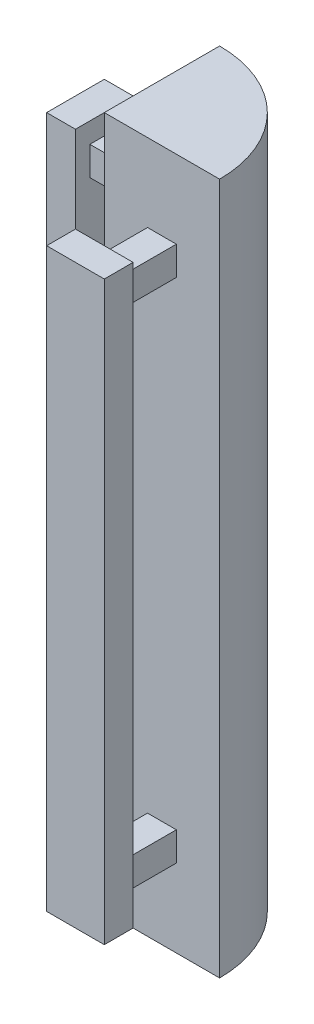
ISO-10303-21;
HEADER;
FILE_DESCRIPTION(('STEP AP214'),'2;1');
FILE_NAME('part.step','',(''),(''),'','','');
FILE_SCHEMA(('AUTOMOTIVE_DESIGN { 1 0 10303 214 1 1 1 1 }'));
ENDSEC;
DATA;
#1=APPLICATION_CONTEXT('core data for automotive mechanical design processes');
#2=APPLICATION_PROTOCOL_DEFINITION('international standard','automotive_design',2000,#1);
#3=PRODUCT_CONTEXT('',#1,'mechanical');
#4=PRODUCT('Part','Part','',(#3));
#5=PRODUCT_RELATED_PRODUCT_CATEGORY('part','',(#4));
#6=PRODUCT_DEFINITION_FORMATION('','',#4);
#7=PRODUCT_DEFINITION_CONTEXT('part definition',#1,'design');
#8=PRODUCT_DEFINITION('design','',#6,#7);
#9=PRODUCT_DEFINITION_SHAPE('','',#8);
#10=(LENGTH_UNIT() NAMED_UNIT(*) SI_UNIT(.MILLI.,.METRE.));
#11=(NAMED_UNIT(*) PLANE_ANGLE_UNIT() SI_UNIT($,.RADIAN.));
#12=(NAMED_UNIT(*) SI_UNIT($,.STERADIAN.) SOLID_ANGLE_UNIT());
#13=UNCERTAINTY_MEASURE_WITH_UNIT(LENGTH_MEASURE(1.E-05),#10,'distance_accuracy_value','');
#14=(GEOMETRIC_REPRESENTATION_CONTEXT(3) GLOBAL_UNCERTAINTY_ASSIGNED_CONTEXT((#13)) GLOBAL_UNIT_ASSIGNED_CONTEXT((#10,
#11,#12)) REPRESENTATION_CONTEXT('',''));
#15=CARTESIAN_POINT('',(0.,0.,0.));
#16=DIRECTION('',(0.,0.,1.));
#17=DIRECTION('',(1.,0.,0.));
#18=AXIS2_PLACEMENT_3D('',#15,#16,#17);
#19=CARTESIAN_POINT('',(0.,304.8,-76.2));
#20=DIRECTION('',(0.,0.,1.));
#21=DIRECTION('',(1.,0.,0.));
#22=AXIS2_PLACEMENT_3D('',#19,#20,#21);
#23=PLANE('',#22);
#24=DIRECTION('',(0.,1.,0.));
#25=VECTOR('',#24,1.);
#26=CARTESIAN_POINT('',(22.2249999999995,457.2,-76.1999999999999));
#27=LINE('',#26,#25);
#28=CARTESIAN_POINT('',(22.2250000000001,169.566930363251,-76.1999999999999));
#29=VERTEX_POINT('',#28);
#30=CARTESIAN_POINT('',(22.2250000000001,175.916930363251,-76.1999999999999));
#31=VERTEX_POINT('',#30);
#32=EDGE_CURVE('E281',#29,#31,#27,.T.);
#33=ORIENTED_EDGE('',*,*,#32,.T.);
#34=DIRECTION('',(-1.,0.,0.));
#35=VECTOR('',#34,1.);
#36=CARTESIAN_POINT('',(-63.5,175.916930363251,-76.2000000000001));
#37=LINE('',#36,#35);
#38=CARTESIAN_POINT('',(28.5750000000001,175.916930363251,-76.2));
#39=VERTEX_POINT('',#38);
#40=EDGE_CURVE('E285',#39,#31,#37,.T.);
#41=ORIENTED_EDGE('',*,*,#40,.F.);
#42=DIRECTION('',(0.,1.,0.));
#43=VECTOR('',#42,1.);
#44=CARTESIAN_POINT('',(28.5750000000001,457.2,-76.1999999999999));
#45=LINE('',#44,#43);
#46=CARTESIAN_POINT('',(28.5750000000001,169.566930363251,-76.1999999999999));
#47=VERTEX_POINT('',#46);
#48=EDGE_CURVE('E300',#47,#39,#45,.T.);
#49=ORIENTED_EDGE('',*,*,#48,.F.);
#50=DIRECTION('',(-1.,0.,0.));
#51=VECTOR('',#50,1.);
#52=CARTESIAN_POINT('',(-63.5,169.566930363251,-76.2000000000001));
#53=LINE('',#52,#51);
#54=EDGE_CURVE('E297',#47,#29,#53,.T.);
#55=ORIENTED_EDGE('',*,*,#54,.T.);
#56=EDGE_LOOP('',(#33,#41,#49,#55));
#57=FACE_BOUND('',#56,.T.);
#58=DIRECTION('',(0.,-1.,0.));
#59=VECTOR('',#58,1.);
#60=CARTESIAN_POINT('',(12.7,304.8,-76.2));
#61=LINE('',#60,#59);
#62=CARTESIAN_POINT('',(12.7,304.8,-76.2));
#63=VERTEX_POINT('',#62);
#64=CARTESIAN_POINT('',(12.7,152.4,-76.2));
#65=VERTEX_POINT('',#64);
#66=EDGE_CURVE('E421',#63,#65,#61,.T.);
#67=ORIENTED_EDGE('',*,*,#66,.T.);
#68=DIRECTION('',(-1.,0.,0.));
#69=VECTOR('',#68,1.);
#70=CARTESIAN_POINT('',(38.1,152.4,-76.2));
#71=LINE('',#70,#69);
#72=CARTESIAN_POINT('',(38.1,152.4,-76.2));
#73=VERTEX_POINT('',#72);
#74=EDGE_CURVE('E411',#73,#65,#71,.T.);
#75=ORIENTED_EDGE('',*,*,#74,.F.);
#76=DIRECTION('',(0.,-1.,0.));
#77=VECTOR('',#76,1.);
#78=CARTESIAN_POINT('',(38.1,304.8,-76.2));
#79=LINE('',#78,#77);
#80=CARTESIAN_POINT('',(38.1,304.8,-76.2));
#81=VERTEX_POINT('',#80);
#82=EDGE_CURVE('E11',#81,#73,#79,.T.);
#83=ORIENTED_EDGE('',*,*,#82,.F.);
#84=DIRECTION('',(-1.,0.,0.));
#85=VECTOR('',#84,1.);
#86=CARTESIAN_POINT('',(0.,304.8,-76.2));
#87=LINE('',#86,#85);
#88=EDGE_CURVE('E47',#81,#63,#87,.T.);
#89=ORIENTED_EDGE('',*,*,#88,.T.);
#90=EDGE_LOOP('',(#67,#75,#83,#89));
#91=FACE_BOUND('',#90,.T.);
#92=DIRECTION('',(-1.,0.,0.));
#93=VECTOR('',#92,1.);
#94=CARTESIAN_POINT('',(-63.5,281.283069636749,-76.2000000000001));
#95=LINE('',#94,#93);
#96=CARTESIAN_POINT('',(28.5750000000001,281.283069636749,-76.1999999999999));
#97=VERTEX_POINT('',#96);
#98=CARTESIAN_POINT('',(22.2250000000001,281.283069636749,-76.1999999999999));
#99=VERTEX_POINT('',#98);
#100=EDGE_CURVE('E242',#97,#99,#95,.T.);
#101=ORIENTED_EDGE('',*,*,#100,.T.);
#102=DIRECTION('',(0.,-1.,0.));
#103=VECTOR('',#102,1.);
#104=CARTESIAN_POINT('',(22.2249999999995,-1.87350135405493E-13,-76.1999999999999));
#105=LINE('',#104,#103);
#106=CARTESIAN_POINT('',(22.2250000000001,287.633069636749,-76.1999999999999));
#107=VERTEX_POINT('',#106);
#108=EDGE_CURVE('E239',#107,#99,#105,.T.);
#109=ORIENTED_EDGE('',*,*,#108,.F.);
#110=DIRECTION('',(-1.,0.,0.));
#111=VECTOR('',#110,1.);
#112=CARTESIAN_POINT('',(-63.5,287.633069636749,-76.2000000000001));
#113=LINE('',#112,#111);
#114=CARTESIAN_POINT('',(28.5750000000001,287.633069636749,-76.2));
#115=VERTEX_POINT('',#114);
#116=EDGE_CURVE('E246',#115,#107,#113,.T.);
#117=ORIENTED_EDGE('',*,*,#116,.F.);
#118=DIRECTION('',(0.,-1.,0.));
#119=VECTOR('',#118,1.);
#120=CARTESIAN_POINT('',(28.5750000000001,0.,-76.1999999999999));
#121=LINE('',#120,#119);
#122=EDGE_CURVE('E54',#115,#97,#121,.T.);
#123=ORIENTED_EDGE('',*,*,#122,.T.);
#124=EDGE_LOOP('',(#101,#109,#117,#123));
#125=FACE_BOUND('',#124,.T.);
#126=ADVANCED_FACE('F39',(#57,#91,#125),#23,.T.);
#127=CARTESIAN_POINT('',(-63.5,0.,-63.5));
#128=DIRECTION('',(0.,0.,1.));
#129=DIRECTION('',(-1.,0.,0.));
#130=AXIS2_PLACEMENT_3D('',#127,#128,#129);
#131=PLANE('',#130);
#132=DIRECTION('',(0.,-1.,0.));
#133=VECTOR('',#132,1.);
#134=CARTESIAN_POINT('',(19.05,0.,-63.4999999999999));
#135=LINE('',#134,#133);
#136=CARTESIAN_POINT('',(19.0500000000001,292.1,-63.4999999999999));
#137=VERTEX_POINT('',#136);
#138=CARTESIAN_POINT('',(19.05,165.1,-63.4999999999999));
#139=VERTEX_POINT('',#138);
#140=EDGE_CURVE('E251',#137,#139,#135,.T.);
#141=ORIENTED_EDGE('',*,*,#140,.F.);
#142=DIRECTION('',(-1.,0.,0.));
#143=VECTOR('',#142,1.);
#144=CARTESIAN_POINT('',(-63.5,292.1,-63.5));
#145=LINE('',#144,#143);
#146=CARTESIAN_POINT('',(31.7500000000001,292.1,-63.4999999999999));
#147=VERTEX_POINT('',#146);
#148=EDGE_CURVE('E255',#147,#137,#145,.T.);
#149=ORIENTED_EDGE('',*,*,#148,.F.);
#150=DIRECTION('',(0.,-1.,0.));
#151=VECTOR('',#150,1.);
#152=CARTESIAN_POINT('',(31.75,0.,-63.4999999999999));
#153=LINE('',#152,#151);
#154=CARTESIAN_POINT('',(31.75,165.1,-63.4999999999999));
#155=VERTEX_POINT('',#154);
#156=EDGE_CURVE('E269',#147,#155,#153,.T.);
#157=ORIENTED_EDGE('',*,*,#156,.T.);
#158=DIRECTION('',(-1.,0.,0.));
#159=VECTOR('',#158,1.);
#160=CARTESIAN_POINT('',(-63.5,165.1,-63.5));
#161=LINE('',#160,#159);
#162=EDGE_CURVE('E266',#155,#139,#161,.T.);
#163=ORIENTED_EDGE('',*,*,#162,.T.);
#164=EDGE_LOOP('',(#141,#149,#157,#163));
#165=FACE_BOUND('',#164,.T.);
#166=DIRECTION('',(0.,1.,0.));
#167=VECTOR('',#166,1.);
#168=CARTESIAN_POINT('',(22.2249999999994,457.2,-63.4999999999999));
#169=LINE('',#168,#167);
#170=CARTESIAN_POINT('',(22.2250000000001,169.566930363251,-63.4999999999999));
#171=VERTEX_POINT('',#170);
#172=CARTESIAN_POINT('',(22.225,175.916930363251,-63.4999999999999));
#173=VERTEX_POINT('',#172);
#174=EDGE_CURVE('E282',#171,#173,#169,.T.);
#175=ORIENTED_EDGE('',*,*,#174,.F.);
#176=DIRECTION('',(-1.,0.,0.));
#177=VECTOR('',#176,1.);
#178=CARTESIAN_POINT('',(-63.5,169.566930363251,-63.5000000000001));
#179=LINE('',#178,#177);
#180=CARTESIAN_POINT('',(28.575,169.566930363251,-63.4999999999999));
#181=VERTEX_POINT('',#180);
#182=EDGE_CURVE('E284',#181,#171,#179,.T.);
#183=ORIENTED_EDGE('',*,*,#182,.F.);
#184=DIRECTION('',(0.,1.,0.));
#185=VECTOR('',#184,1.);
#186=CARTESIAN_POINT('',(28.575,457.2,-63.4999999999999));
#187=LINE('',#186,#185);
#188=CARTESIAN_POINT('',(28.575,175.916930363251,-63.4999999999999));
#189=VERTEX_POINT('',#188);
#190=EDGE_CURVE('E288',#181,#189,#187,.T.);
#191=ORIENTED_EDGE('',*,*,#190,.T.);
#192=DIRECTION('',(-1.,0.,0.));
#193=VECTOR('',#192,1.);
#194=CARTESIAN_POINT('',(-63.5,175.916930363251,-63.5000000000001));
#195=LINE('',#194,#193);
#196=EDGE_CURVE('E291',#189,#173,#195,.T.);
#197=ORIENTED_EDGE('',*,*,#196,.T.);
#198=EDGE_LOOP('',(#175,#183,#191,#197));
#199=FACE_BOUND('',#198,.T.);
#200=DIRECTION('',(0.,-1.,0.));
#201=VECTOR('',#200,1.);
#202=CARTESIAN_POINT('',(22.2249999999994,-1.87350135405493E-13,-63.4999999999999));
#203=LINE('',#202,#201);
#204=CARTESIAN_POINT('',(22.2250000000001,287.633069636749,-63.4999999999999));
#205=VERTEX_POINT('',#204);
#206=CARTESIAN_POINT('',(22.2250000000001,281.283069636749,-63.4999999999999));
#207=VERTEX_POINT('',#206);
#208=EDGE_CURVE('E62',#205,#207,#203,.T.);
#209=ORIENTED_EDGE('',*,*,#208,.T.);
#210=DIRECTION('',(-1.,0.,0.));
#211=VECTOR('',#210,1.);
#212=CARTESIAN_POINT('',(-63.5,281.283069636749,-63.5000000000001));
#213=LINE('',#212,#211);
#214=CARTESIAN_POINT('',(28.575,281.283069636749,-63.4999999999999));
#215=VERTEX_POINT('',#214);
#216=EDGE_CURVE('E223',#215,#207,#213,.T.);
#217=ORIENTED_EDGE('',*,*,#216,.F.);
#218=DIRECTION('',(0.,-1.,0.));
#219=VECTOR('',#218,1.);
#220=CARTESIAN_POINT('',(28.575,0.,-63.4999999999999));
#221=LINE('',#220,#219);
#222=CARTESIAN_POINT('',(28.575,287.633069636749,-63.4999999999999));
#223=VERTEX_POINT('',#222);
#224=EDGE_CURVE('E217',#223,#215,#221,.T.);
#225=ORIENTED_EDGE('',*,*,#224,.F.);
#226=DIRECTION('',(-1.,0.,0.));
#227=VECTOR('',#226,1.);
#228=CARTESIAN_POINT('',(-63.5,287.633069636749,-63.5000000000001));
#229=LINE('',#228,#227);
#230=EDGE_CURVE('E220',#223,#205,#229,.T.);
#231=ORIENTED_EDGE('',*,*,#230,.T.);
#232=EDGE_LOOP('',(#209,#217,#225,#231));
#233=FACE_BOUND('',#232,.T.);
#234=ADVANCED_FACE('F218',(#165,#199,#233),#131,.F.);
#235=CARTESIAN_POINT('',(12.7,304.8,0.));
#236=DIRECTION('',(1.,0.,0.));
#237=DIRECTION('',(0.,0.,-1.));
#238=AXIS2_PLACEMENT_3D('',#235,#236,#237);
#239=PLANE('',#238);
#240=DIRECTION('',(0.,0.,-1.));
#241=VECTOR('',#240,1.);
#242=CARTESIAN_POINT('',(12.7,152.4,-76.2));
#243=LINE('',#242,#241);
#244=CARTESIAN_POINT('',(12.7,152.4,-101.6));
#245=VERTEX_POINT('',#244);
#246=EDGE_CURVE('E413',#65,#245,#243,.T.);
#247=ORIENTED_EDGE('',*,*,#246,.F.);
#248=ORIENTED_EDGE('',*,*,#66,.F.);
#249=DIRECTION('',(0.,0.,1.));
#250=VECTOR('',#249,1.);
#251=CARTESIAN_POINT('',(12.7,304.8,0.));
#252=LINE('',#251,#250);
#253=CARTESIAN_POINT('',(12.7,304.8,-101.6));
#254=VERTEX_POINT('',#253);
#255=EDGE_CURVE('E417',#254,#63,#252,.T.);
#256=ORIENTED_EDGE('',*,*,#255,.F.);
#257=DIRECTION('',(0.,-1.,0.));
#258=VECTOR('',#257,1.);
#259=CARTESIAN_POINT('',(12.7,304.8,-101.6));
#260=LINE('',#259,#258);
#261=EDGE_CURVE('E420',#254,#245,#260,.T.);
#262=ORIENTED_EDGE('',*,*,#261,.T.);
#263=EDGE_LOOP('',(#247,#248,#256,#262));
#264=FACE_BOUND('',#263,.T.);
#265=DIRECTION('',(0.,0.,1.));
#266=VECTOR('',#265,1.);
#267=CARTESIAN_POINT('',(12.7,287.633069636749,0.));
#268=LINE('',#267,#266);
#269=CARTESIAN_POINT('',(12.7,287.633069636749,-92.075));
#270=VERTEX_POINT('',#269);
#271=CARTESIAN_POINT('',(12.7,287.633069636749,-85.725));
#272=VERTEX_POINT('',#271);
#273=EDGE_CURVE('E391',#270,#272,#268,.T.);
#274=ORIENTED_EDGE('',*,*,#273,.T.);
#275=DIRECTION('',(0.,-1.,0.));
#276=VECTOR('',#275,1.);
#277=CARTESIAN_POINT('',(12.7,-1.87350135405493E-13,-85.7249999999994));
#278=LINE('',#277,#276);
#279=CARTESIAN_POINT('',(12.7,281.283069636749,-85.725));
#280=VERTEX_POINT('',#279);
#281=EDGE_CURVE('E376',#272,#280,#278,.T.);
#282=ORIENTED_EDGE('',*,*,#281,.T.);
#283=DIRECTION('',(0.,0.,1.));
#284=VECTOR('',#283,1.);
#285=CARTESIAN_POINT('',(12.7,281.283069636749,0.));
#286=LINE('',#285,#284);
#287=CARTESIAN_POINT('',(12.7,281.283069636749,-92.075));
#288=VERTEX_POINT('',#287);
#289=EDGE_CURVE('E380',#288,#280,#286,.T.);
#290=ORIENTED_EDGE('',*,*,#289,.F.);
#291=DIRECTION('',(0.,-1.,0.));
#292=VECTOR('',#291,1.);
#293=CARTESIAN_POINT('',(12.7,0.,-92.075));
#294=LINE('',#293,#292);
#295=EDGE_CURVE('E393',#270,#288,#294,.T.);
#296=ORIENTED_EDGE('',*,*,#295,.F.);
#297=EDGE_LOOP('',(#274,#282,#290,#296));
#298=FACE_BOUND('',#297,.T.);
#299=DIRECTION('',(0.,1.,0.));
#300=VECTOR('',#299,1.);
#301=CARTESIAN_POINT('',(12.7,457.2,-85.7249999999994));
#302=LINE('',#301,#300);
#303=CARTESIAN_POINT('',(12.7,169.566930363251,-85.725));
#304=VERTEX_POINT('',#303);
#305=CARTESIAN_POINT('',(12.7,175.916930363251,-85.725));
#306=VERTEX_POINT('',#305);
#307=EDGE_CURVE('E342',#304,#306,#302,.T.);
#308=ORIENTED_EDGE('',*,*,#307,.F.);
#309=DIRECTION('',(0.,0.,1.));
#310=VECTOR('',#309,1.);
#311=CARTESIAN_POINT('',(12.7,169.566930363251,0.));
#312=LINE('',#311,#310);
#313=CARTESIAN_POINT('',(12.7,169.566930363251,-92.075));
#314=VERTEX_POINT('',#313);
#315=EDGE_CURVE('E347',#314,#304,#312,.T.);
#316=ORIENTED_EDGE('',*,*,#315,.F.);
#317=DIRECTION('',(0.,1.,0.));
#318=VECTOR('',#317,1.);
#319=CARTESIAN_POINT('',(12.7,457.2,-92.075));
#320=LINE('',#319,#318);
#321=CARTESIAN_POINT('',(12.7,175.916930363251,-92.075));
#322=VERTEX_POINT('',#321);
#323=EDGE_CURVE('E361',#314,#322,#320,.T.);
#324=ORIENTED_EDGE('',*,*,#323,.T.);
#325=DIRECTION('',(0.,0.,1.));
#326=VECTOR('',#325,1.);
#327=CARTESIAN_POINT('',(12.7,175.916930363251,0.));
#328=LINE('',#327,#326);
#329=EDGE_CURVE('E359',#322,#306,#328,.T.);
#330=ORIENTED_EDGE('',*,*,#329,.T.);
#331=EDGE_LOOP('',(#308,#316,#324,#330));
#332=FACE_BOUND('',#331,.T.);
#333=ADVANCED_FACE('F436',(#264,#298,#332),#239,.F.);
#334=CARTESIAN_POINT('',(12.7,304.8,-76.2));
#335=DIRECTION('',(0.,-1.,0.));
#336=DIRECTION('',(0.,0.,-1.));
#337=AXIS2_PLACEMENT_3D('',#334,#335,#336);
#338=CYLINDRICAL_SURFACE('',#337,25.4);
#339=ORIENTED_EDGE('',*,*,#82,.T.);
#340=CARTESIAN_POINT('',(12.7,152.4,-76.2));
#341=DIRECTION('',(0.,-1.,0.));
#342=DIRECTION('',(0.,0.,-1.));
#343=AXIS2_PLACEMENT_3D('',#340,#341,#342);
#344=CIRCLE('',#343,25.4);
#345=EDGE_CURVE('E409',#245,#73,#344,.T.);
#346=ORIENTED_EDGE('',*,*,#345,.F.);
#347=ORIENTED_EDGE('',*,*,#261,.F.);
#348=CARTESIAN_POINT('',(12.7,304.8,-76.2));
#349=DIRECTION('',(0.,-1.,0.));
#350=DIRECTION('',(0.,0.,-1.));
#351=AXIS2_PLACEMENT_3D('',#348,#349,#350);
#352=CIRCLE('',#351,25.4);
#353=EDGE_CURVE('E415',#254,#81,#352,.T.);
#354=ORIENTED_EDGE('',*,*,#353,.T.);
#355=EDGE_LOOP('',(#339,#346,#347,#354));
#356=FACE_BOUND('',#355,.T.);
#357=ADVANCED_FACE('F442',(#356),#338,.T.);
#358=CARTESIAN_POINT('',(0.,304.8,0.));
#359=DIRECTION('',(0.,-1.,0.));
#360=DIRECTION('',(0.,0.,-1.));
#361=AXIS2_PLACEMENT_3D('',#358,#359,#360);
#362=PLANE('',#361);
#363=ORIENTED_EDGE('',*,*,#353,.F.);
#364=ORIENTED_EDGE('',*,*,#255,.T.);
#365=ORIENTED_EDGE('',*,*,#88,.F.);
#366=EDGE_LOOP('',(#363,#364,#365));
#367=FACE_BOUND('',#366,.T.);
#368=ADVANCED_FACE('F41',(#367),#362,.F.);
#369=CARTESIAN_POINT('',(12.7,152.4,-76.2));
#370=DIRECTION('',(0.,-1.,0.));
#371=DIRECTION('',(0.,0.,-1.));
#372=AXIS2_PLACEMENT_3D('',#369,#370,#371);
#373=PLANE('',#372);
#374=ORIENTED_EDGE('',*,*,#345,.T.);
#375=ORIENTED_EDGE('',*,*,#74,.T.);
#376=ORIENTED_EDGE('',*,*,#246,.T.);
#377=EDGE_LOOP('',(#374,#375,#376));
#378=FACE_BOUND('',#377,.T.);
#379=ADVANCED_FACE('F440',(#378),#373,.T.);
#380=CARTESIAN_POINT('',(0.,-1.87350135405493E-13,-85.7249999999994));
#381=DIRECTION('',(0.,0.,1.));
#382=DIRECTION('',(0.,-1.,0.));
#383=AXIS2_PLACEMENT_3D('',#380,#381,#382);
#384=PLANE('',#383);
#385=ORIENTED_EDGE('',*,*,#281,.F.);
#386=DIRECTION('',(1.,0.,0.));
#387=VECTOR('',#386,1.);
#388=CARTESIAN_POINT('',(0.,287.633069636749,-85.725));
#389=LINE('',#388,#387);
#390=CARTESIAN_POINT('',(0.,287.633069636749,-85.725));
#391=VERTEX_POINT('',#390);
#392=EDGE_CURVE('E406',#391,#272,#389,.T.);
#393=ORIENTED_EDGE('',*,*,#392,.F.);
#394=DIRECTION('',(0.,-1.,0.));
#395=VECTOR('',#394,1.);
#396=CARTESIAN_POINT('',(0.,-1.87350135405493E-13,-85.7249999999994));
#397=LINE('',#396,#395);
#398=CARTESIAN_POINT('',(0.,281.283069636749,-85.725));
#399=VERTEX_POINT('',#398);
#400=EDGE_CURVE('E377',#391,#399,#397,.T.);
#401=ORIENTED_EDGE('',*,*,#400,.T.);
#402=DIRECTION('',(1.,0.,0.));
#403=VECTOR('',#402,1.);
#404=CARTESIAN_POINT('',(0.,281.283069636749,-85.725));
#405=LINE('',#404,#403);
#406=EDGE_CURVE('E389',#399,#280,#405,.T.);
#407=ORIENTED_EDGE('',*,*,#406,.T.);
#408=EDGE_LOOP('',(#385,#393,#401,#407));
#409=FACE_BOUND('',#408,.T.);
#410=ADVANCED_FACE('F537',(#409),#384,.T.);
#411=CARTESIAN_POINT('',(0.,287.633069636749,0.));
#412=DIRECTION('',(0.,1.,0.));
#413=DIRECTION('',(0.,0.,1.));
#414=AXIS2_PLACEMENT_3D('',#411,#412,#413);
#415=PLANE('',#414);
#416=ORIENTED_EDGE('',*,*,#273,.F.);
#417=DIRECTION('',(1.,0.,0.));
#418=VECTOR('',#417,1.);
#419=CARTESIAN_POINT('',(0.,287.633069636749,-92.075));
#420=LINE('',#419,#418);
#421=CARTESIAN_POINT('',(0.,287.633069636749,-92.075));
#422=VERTEX_POINT('',#421);
#423=EDGE_CURVE('E403',#422,#270,#420,.T.);
#424=ORIENTED_EDGE('',*,*,#423,.F.);
#425=DIRECTION('',(0.,0.,1.));
#426=VECTOR('',#425,1.);
#427=CARTESIAN_POINT('',(0.,287.633069636749,0.));
#428=LINE('',#427,#426);
#429=EDGE_CURVE('E379',#422,#391,#428,.T.);
#430=ORIENTED_EDGE('',*,*,#429,.T.);
#431=ORIENTED_EDGE('',*,*,#392,.T.);
#432=EDGE_LOOP('',(#416,#424,#430,#431));
#433=FACE_BOUND('',#432,.T.);
#434=ADVANCED_FACE('F533',(#433),#415,.T.);
#435=CARTESIAN_POINT('',(0.,0.,-92.075));
#436=DIRECTION('',(0.,0.,1.));
#437=DIRECTION('',(1.,0.,0.));
#438=AXIS2_PLACEMENT_3D('',#435,#436,#437);
#439=PLANE('',#438);
#440=ORIENTED_EDGE('',*,*,#295,.T.);
#441=DIRECTION('',(1.,0.,0.));
#442=VECTOR('',#441,1.);
#443=CARTESIAN_POINT('',(0.,281.283069636749,-92.075));
#444=LINE('',#443,#442);
#445=CARTESIAN_POINT('',(0.,281.283069636749,-92.075));
#446=VERTEX_POINT('',#445);
#447=EDGE_CURVE('E400',#446,#288,#444,.T.);
#448=ORIENTED_EDGE('',*,*,#447,.F.);
#449=DIRECTION('',(0.,-1.,0.));
#450=VECTOR('',#449,1.);
#451=CARTESIAN_POINT('',(0.,0.,-92.075));
#452=LINE('',#451,#450);
#453=EDGE_CURVE('E383',#422,#446,#452,.T.);
#454=ORIENTED_EDGE('',*,*,#453,.F.);
#455=ORIENTED_EDGE('',*,*,#423,.T.);
#456=EDGE_LOOP('',(#440,#448,#454,#455));
#457=FACE_BOUND('',#456,.T.);
#458=ADVANCED_FACE('F529',(#457),#439,.F.);
#459=CARTESIAN_POINT('',(0.,281.283069636749,0.));
#460=DIRECTION('',(0.,1.,0.));
#461=DIRECTION('',(0.,0.,1.));
#462=AXIS2_PLACEMENT_3D('',#459,#460,#461);
#463=PLANE('',#462);
#464=ORIENTED_EDGE('',*,*,#289,.T.);
#465=ORIENTED_EDGE('',*,*,#406,.F.);
#466=DIRECTION('',(0.,0.,1.));
#467=VECTOR('',#466,1.);
#468=CARTESIAN_POINT('',(0.,281.283069636749,0.));
#469=LINE('',#468,#467);
#470=EDGE_CURVE('E386',#446,#399,#469,.T.);
#471=ORIENTED_EDGE('',*,*,#470,.F.);
#472=ORIENTED_EDGE('',*,*,#447,.T.);
#473=EDGE_LOOP('',(#464,#465,#471,#472));
#474=FACE_BOUND('',#473,.T.);
#475=ADVANCED_FACE('F525',(#474),#463,.F.);
#476=CARTESIAN_POINT('',(0.,457.2,-85.7249999999994));
#477=DIRECTION('',(0.,0.,-1.));
#478=DIRECTION('',(0.,1.,0.));
#479=AXIS2_PLACEMENT_3D('',#476,#477,#478);
#480=PLANE('',#479);
#481=ORIENTED_EDGE('',*,*,#307,.T.);
#482=DIRECTION('',(1.,0.,0.));
#483=VECTOR('',#482,1.);
#484=CARTESIAN_POINT('',(0.,175.916930363251,-85.725));
#485=LINE('',#484,#483);
#486=CARTESIAN_POINT('',(0.,175.916930363251,-85.725));
#487=VERTEX_POINT('',#486);
#488=EDGE_CURVE('E373',#487,#306,#485,.T.);
#489=ORIENTED_EDGE('',*,*,#488,.F.);
#490=DIRECTION('',(0.,1.,0.));
#491=VECTOR('',#490,1.);
#492=CARTESIAN_POINT('',(0.,457.2,-85.7249999999994));
#493=LINE('',#492,#491);
#494=CARTESIAN_POINT('',(0.,169.566930363251,-85.725));
#495=VERTEX_POINT('',#494);
#496=EDGE_CURVE('E343',#495,#487,#493,.T.);
#497=ORIENTED_EDGE('',*,*,#496,.F.);
#498=DIRECTION('',(1.,0.,0.));
#499=VECTOR('',#498,1.);
#500=CARTESIAN_POINT('',(0.,169.566930363251,-85.725));
#501=LINE('',#500,#499);
#502=EDGE_CURVE('E356',#495,#304,#501,.T.);
#503=ORIENTED_EDGE('',*,*,#502,.T.);
#504=EDGE_LOOP('',(#481,#489,#497,#503));
#505=FACE_BOUND('',#504,.T.);
#506=ADVANCED_FACE('F521',(#505),#480,.F.);
#507=CARTESIAN_POINT('',(0.,175.916930363251,0.));
#508=DIRECTION('',(0.,1.,0.));
#509=DIRECTION('',(0.,0.,1.));
#510=AXIS2_PLACEMENT_3D('',#507,#508,#509);
#511=PLANE('',#510);
#512=ORIENTED_EDGE('',*,*,#329,.F.);
#513=DIRECTION('',(1.,0.,0.));
#514=VECTOR('',#513,1.);
#515=CARTESIAN_POINT('',(0.,175.916930363251,-92.075));
#516=LINE('',#515,#514);
#517=CARTESIAN_POINT('',(0.,175.916930363251,-92.075));
#518=VERTEX_POINT('',#517);
#519=EDGE_CURVE('E370',#518,#322,#516,.T.);
#520=ORIENTED_EDGE('',*,*,#519,.F.);
#521=DIRECTION('',(0.,0.,1.));
#522=VECTOR('',#521,1.);
#523=CARTESIAN_POINT('',(0.,175.916930363251,0.));
#524=LINE('',#523,#522);
#525=EDGE_CURVE('E346',#518,#487,#524,.T.);
#526=ORIENTED_EDGE('',*,*,#525,.T.);
#527=ORIENTED_EDGE('',*,*,#488,.T.);
#528=EDGE_LOOP('',(#512,#520,#526,#527));
#529=FACE_BOUND('',#528,.T.);
#530=ADVANCED_FACE('F517',(#529),#511,.T.);
#531=CARTESIAN_POINT('',(0.,457.2,-92.075));
#532=DIRECTION('',(0.,0.,-1.));
#533=DIRECTION('',(-1.,0.,0.));
#534=AXIS2_PLACEMENT_3D('',#531,#532,#533);
#535=PLANE('',#534);
#536=ORIENTED_EDGE('',*,*,#323,.F.);
#537=DIRECTION('',(1.,0.,0.));
#538=VECTOR('',#537,1.);
#539=CARTESIAN_POINT('',(0.,169.566930363251,-92.075));
#540=LINE('',#539,#538);
#541=CARTESIAN_POINT('',(0.,169.566930363251,-92.075));
#542=VERTEX_POINT('',#541);
#543=EDGE_CURVE('E367',#542,#314,#540,.T.);
#544=ORIENTED_EDGE('',*,*,#543,.F.);
#545=DIRECTION('',(0.,1.,0.));
#546=VECTOR('',#545,1.);
#547=CARTESIAN_POINT('',(0.,457.2,-92.075));
#548=LINE('',#547,#546);
#549=EDGE_CURVE('E350',#542,#518,#548,.T.);
#550=ORIENTED_EDGE('',*,*,#549,.T.);
#551=ORIENTED_EDGE('',*,*,#519,.T.);
#552=EDGE_LOOP('',(#536,#544,#550,#551));
#553=FACE_BOUND('',#552,.T.);
#554=ADVANCED_FACE('F513',(#553),#535,.T.);
#555=CARTESIAN_POINT('',(0.,169.566930363251,0.));
#556=DIRECTION('',(0.,1.,0.));
#557=DIRECTION('',(0.,0.,1.));
#558=AXIS2_PLACEMENT_3D('',#555,#556,#557);
#559=PLANE('',#558);
#560=ORIENTED_EDGE('',*,*,#315,.T.);
#561=ORIENTED_EDGE('',*,*,#502,.F.);
#562=DIRECTION('',(0.,0.,1.));
#563=VECTOR('',#562,1.);
#564=CARTESIAN_POINT('',(0.,169.566930363251,0.));
#565=LINE('',#564,#563);
#566=EDGE_CURVE('E353',#542,#495,#565,.T.);
#567=ORIENTED_EDGE('',*,*,#566,.F.);
#568=ORIENTED_EDGE('',*,*,#543,.T.);
#569=EDGE_LOOP('',(#560,#561,#567,#568));
#570=FACE_BOUND('',#569,.T.);
#571=ADVANCED_FACE('F495',(#570),#559,.F.);
#572=CARTESIAN_POINT('',(0.,0.,0.));
#573=DIRECTION('',(-1.,0.,0.));
#574=DIRECTION('',(0.,0.,1.));
#575=AXIS2_PLACEMENT_3D('',#572,#573,#574);
#576=PLANE('',#575);
#577=ORIENTED_EDGE('',*,*,#400,.F.);
#578=ORIENTED_EDGE('',*,*,#429,.F.);
#579=ORIENTED_EDGE('',*,*,#453,.T.);
#580=ORIENTED_EDGE('',*,*,#470,.T.);
#581=EDGE_LOOP('',(#577,#578,#579,#580));
#582=FACE_BOUND('',#581,.T.);
#583=DIRECTION('',(0.,-1.,0.));
#584=VECTOR('',#583,1.);
#585=CARTESIAN_POINT('',(0.,0.,-82.55));
#586=LINE('',#585,#584);
#587=CARTESIAN_POINT('',(0.,292.1,-82.55));
#588=VERTEX_POINT('',#587);
#589=CARTESIAN_POINT('',(0.,165.1,-82.55));
#590=VERTEX_POINT('',#589);
#591=EDGE_CURVE('E312',#588,#590,#586,.T.);
#592=ORIENTED_EDGE('',*,*,#591,.T.);
#593=DIRECTION('',(0.,0.,1.));
#594=VECTOR('',#593,1.);
#595=CARTESIAN_POINT('',(0.,165.1,0.));
#596=LINE('',#595,#594);
#597=CARTESIAN_POINT('',(0.,165.1,-95.25));
#598=VERTEX_POINT('',#597);
#599=EDGE_CURVE('E317',#598,#590,#596,.T.);
#600=ORIENTED_EDGE('',*,*,#599,.F.);
#601=DIRECTION('',(0.,-1.,0.));
#602=VECTOR('',#601,1.);
#603=CARTESIAN_POINT('',(0.,0.,-95.25));
#604=LINE('',#603,#602);
#605=CARTESIAN_POINT('',(0.,292.1,-95.25));
#606=VERTEX_POINT('',#605);
#607=EDGE_CURVE('E330',#606,#598,#604,.T.);
#608=ORIENTED_EDGE('',*,*,#607,.F.);
#609=DIRECTION('',(0.,0.,1.));
#610=VECTOR('',#609,1.);
#611=CARTESIAN_POINT('',(0.,292.1,0.));
#612=LINE('',#611,#610);
#613=EDGE_CURVE('E327',#606,#588,#612,.T.);
#614=ORIENTED_EDGE('',*,*,#613,.T.);
#615=EDGE_LOOP('',(#592,#600,#608,#614));
#616=FACE_BOUND('',#615,.T.);
#617=ORIENTED_EDGE('',*,*,#566,.T.);
#618=ORIENTED_EDGE('',*,*,#496,.T.);
#619=ORIENTED_EDGE('',*,*,#525,.F.);
#620=ORIENTED_EDGE('',*,*,#549,.F.);
#621=EDGE_LOOP('',(#617,#618,#619,#620));
#622=FACE_BOUND('',#621,.T.);
#623=ADVANCED_FACE('F491',(#582,#616,#622),#576,.F.);
#624=CARTESIAN_POINT('',(-6.35000000000001,0.,-82.55));
#625=DIRECTION('',(0.,0.,1.));
#626=DIRECTION('',(0.,-1.,0.));
#627=AXIS2_PLACEMENT_3D('',#624,#625,#626);
#628=PLANE('',#627);
#629=ORIENTED_EDGE('',*,*,#591,.F.);
#630=DIRECTION('',(1.,0.,0.));
#631=VECTOR('',#630,1.);
#632=CARTESIAN_POINT('',(-6.35000000000001,292.1,-82.55));
#633=LINE('',#632,#631);
#634=CARTESIAN_POINT('',(-6.35000000000001,292.1,-82.55));
#635=VERTEX_POINT('',#634);
#636=EDGE_CURVE('E340',#635,#588,#633,.T.);
#637=ORIENTED_EDGE('',*,*,#636,.F.);
#638=DIRECTION('',(0.,-1.,0.));
#639=VECTOR('',#638,1.);
#640=CARTESIAN_POINT('',(-6.35000000000001,0.,-82.55));
#641=LINE('',#640,#639);
#642=CARTESIAN_POINT('',(-6.35000000000001,165.1,-82.55));
#643=VERTEX_POINT('',#642);
#644=EDGE_CURVE('E313',#635,#643,#641,.T.);
#645=ORIENTED_EDGE('',*,*,#644,.T.);
#646=DIRECTION('',(1.,0.,0.));
#647=VECTOR('',#646,1.);
#648=CARTESIAN_POINT('',(-6.35000000000001,165.1,-82.55));
#649=LINE('',#648,#647);
#650=EDGE_CURVE('E324',#643,#590,#649,.T.);
#651=ORIENTED_EDGE('',*,*,#650,.T.);
#652=EDGE_LOOP('',(#629,#637,#645,#651));
#653=FACE_BOUND('',#652,.T.);
#654=ADVANCED_FACE('F494',(#653),#628,.T.);
#655=CARTESIAN_POINT('',(-6.35,292.1,0.));
#656=DIRECTION('',(0.,1.,0.));
#657=DIRECTION('',(0.,0.,1.));
#658=AXIS2_PLACEMENT_3D('',#655,#656,#657);
#659=PLANE('',#658);
#660=ORIENTED_EDGE('',*,*,#613,.F.);
#661=DIRECTION('',(1.,0.,0.));
#662=VECTOR('',#661,1.);
#663=CARTESIAN_POINT('',(-6.35000000000001,292.1,-95.25));
#664=LINE('',#663,#662);
#665=CARTESIAN_POINT('',(-6.35000000000001,292.1,-95.25));
#666=VERTEX_POINT('',#665);
#667=EDGE_CURVE('E338',#666,#606,#664,.T.);
#668=ORIENTED_EDGE('',*,*,#667,.F.);
#669=DIRECTION('',(0.,0.,1.));
#670=VECTOR('',#669,1.);
#671=CARTESIAN_POINT('',(-6.35,292.1,0.));
#672=LINE('',#671,#670);
#673=EDGE_CURVE('E316',#666,#635,#672,.T.);
#674=ORIENTED_EDGE('',*,*,#673,.T.);
#675=ORIENTED_EDGE('',*,*,#636,.T.);
#676=EDGE_LOOP('',(#660,#668,#674,#675));
#677=FACE_BOUND('',#676,.T.);
#678=ADVANCED_FACE('F503',(#677),#659,.T.);
#679=CARTESIAN_POINT('',(-6.35000000000001,0.,-95.25));
#680=DIRECTION('',(0.,0.,1.));
#681=DIRECTION('',(0.,-1.,0.));
#682=AXIS2_PLACEMENT_3D('',#679,#680,#681);
#683=PLANE('',#682);
#684=ORIENTED_EDGE('',*,*,#607,.T.);
#685=DIRECTION('',(1.,0.,0.));
#686=VECTOR('',#685,1.);
#687=CARTESIAN_POINT('',(-6.35000000000001,165.1,-95.25));
#688=LINE('',#687,#686);
#689=CARTESIAN_POINT('',(-6.35000000000001,165.1,-95.25));
#690=VERTEX_POINT('',#689);
#691=EDGE_CURVE('E335',#690,#598,#688,.T.);
#692=ORIENTED_EDGE('',*,*,#691,.F.);
#693=DIRECTION('',(0.,-1.,0.));
#694=VECTOR('',#693,1.);
#695=CARTESIAN_POINT('',(-6.35000000000001,0.,-95.25));
#696=LINE('',#695,#694);
#697=EDGE_CURVE('E320',#666,#690,#696,.T.);
#698=ORIENTED_EDGE('',*,*,#697,.F.);
#699=ORIENTED_EDGE('',*,*,#667,.T.);
#700=EDGE_LOOP('',(#684,#692,#698,#699));
#701=FACE_BOUND('',#700,.T.);
#702=ADVANCED_FACE('F499',(#701),#683,.F.);
#703=CARTESIAN_POINT('',(-6.35,165.1,0.));
#704=DIRECTION('',(0.,1.,0.));
#705=DIRECTION('',(0.,0.,1.));
#706=AXIS2_PLACEMENT_3D('',#703,#704,#705);
#707=PLANE('',#706);
#708=ORIENTED_EDGE('',*,*,#599,.T.);
#709=ORIENTED_EDGE('',*,*,#650,.F.);
#710=DIRECTION('',(0.,0.,1.));
#711=VECTOR('',#710,1.);
#712=CARTESIAN_POINT('',(-6.35,165.1,0.));
#713=LINE('',#712,#711);
#714=EDGE_CURVE('E322',#690,#643,#713,.T.);
#715=ORIENTED_EDGE('',*,*,#714,.F.);
#716=ORIENTED_EDGE('',*,*,#691,.T.);
#717=EDGE_LOOP('',(#708,#709,#715,#716));
#718=FACE_BOUND('',#717,.T.);
#719=ADVANCED_FACE('F489',(#718),#707,.F.);
#720=CARTESIAN_POINT('',(-6.35,0.,0.));
#721=DIRECTION('',(-1.,0.,0.));
#722=DIRECTION('',(0.,0.,1.));
#723=AXIS2_PLACEMENT_3D('',#720,#721,#722);
#724=PLANE('',#723);
#725=ORIENTED_EDGE('',*,*,#644,.F.);
#726=ORIENTED_EDGE('',*,*,#673,.F.);
#727=ORIENTED_EDGE('',*,*,#697,.T.);
#728=ORIENTED_EDGE('',*,*,#714,.T.);
#729=EDGE_LOOP('',(#725,#726,#727,#728));
#730=FACE_BOUND('',#729,.T.);
#731=ADVANCED_FACE('F483',(#730),#724,.T.);
#732=CARTESIAN_POINT('',(22.2249999999994,457.2,-63.4999999999999));
#733=DIRECTION('',(-1.,0.,0.));
#734=DIRECTION('',(0.,-1.,0.));
#735=AXIS2_PLACEMENT_3D('',#732,#733,#734);
#736=PLANE('',#735);
#737=ORIENTED_EDGE('',*,*,#32,.F.);
#738=DIRECTION('',(0.,0.,-1.));
#739=VECTOR('',#738,1.);
#740=CARTESIAN_POINT('',(22.2250000000001,169.566930363251,-63.4999999999999));
#741=LINE('',#740,#739);
#742=EDGE_CURVE('E310',#171,#29,#741,.T.);
#743=ORIENTED_EDGE('',*,*,#742,.F.);
#744=ORIENTED_EDGE('',*,*,#174,.T.);
#745=DIRECTION('',(0.,0.,-1.));
#746=VECTOR('',#745,1.);
#747=CARTESIAN_POINT('',(22.225,175.916930363251,-63.4999999999999));
#748=LINE('',#747,#746);
#749=EDGE_CURVE('E294',#173,#31,#748,.T.);
#750=ORIENTED_EDGE('',*,*,#749,.T.);
#751=EDGE_LOOP('',(#737,#743,#744,#750));
#752=FACE_BOUND('',#751,.T.);
#753=ADVANCED_FACE('F463',(#752),#736,.T.);
#754=CARTESIAN_POINT('',(-63.5,169.566930363251,-63.5000000000001));
#755=DIRECTION('',(0.,-1.,0.));
#756=DIRECTION('',(0.,0.,-1.));
#757=AXIS2_PLACEMENT_3D('',#754,#755,#756);
#758=PLANE('',#757);
#759=ORIENTED_EDGE('',*,*,#54,.F.);
#760=DIRECTION('',(0.,0.,-1.));
#761=VECTOR('',#760,1.);
#762=CARTESIAN_POINT('',(28.575,169.566930363251,-63.4999999999999));
#763=LINE('',#762,#761);
#764=EDGE_CURVE('E308',#181,#47,#763,.T.);
#765=ORIENTED_EDGE('',*,*,#764,.F.);
#766=ORIENTED_EDGE('',*,*,#182,.T.);
#767=ORIENTED_EDGE('',*,*,#742,.T.);
#768=EDGE_LOOP('',(#759,#765,#766,#767));
#769=FACE_BOUND('',#768,.T.);
#770=ADVANCED_FACE('F474',(#769),#758,.T.);
#771=CARTESIAN_POINT('',(28.575,457.2,-63.4999999999999));
#772=DIRECTION('',(-1.,0.,0.));
#773=DIRECTION('',(0.,0.,1.));
#774=AXIS2_PLACEMENT_3D('',#771,#772,#773);
#775=PLANE('',#774);
#776=ORIENTED_EDGE('',*,*,#48,.T.);
#777=DIRECTION('',(0.,0.,-1.));
#778=VECTOR('',#777,1.);
#779=CARTESIAN_POINT('',(28.575,175.916930363251,-63.4999999999999));
#780=LINE('',#779,#778);
#781=EDGE_CURVE('E306',#189,#39,#780,.T.);
#782=ORIENTED_EDGE('',*,*,#781,.F.);
#783=ORIENTED_EDGE('',*,*,#190,.F.);
#784=ORIENTED_EDGE('',*,*,#764,.T.);
#785=EDGE_LOOP('',(#776,#782,#783,#784));
#786=FACE_BOUND('',#785,.T.);
#787=ADVANCED_FACE('F471',(#786),#775,.F.);
#788=CARTESIAN_POINT('',(-63.5,175.916930363251,-63.5000000000001));
#789=DIRECTION('',(0.,-1.,0.));
#790=DIRECTION('',(0.,0.,-1.));
#791=AXIS2_PLACEMENT_3D('',#788,#789,#790);
#792=PLANE('',#791);
#793=ORIENTED_EDGE('',*,*,#40,.T.);
#794=ORIENTED_EDGE('',*,*,#749,.F.);
#795=ORIENTED_EDGE('',*,*,#196,.F.);
#796=ORIENTED_EDGE('',*,*,#781,.T.);
#797=EDGE_LOOP('',(#793,#794,#795,#796));
#798=FACE_BOUND('',#797,.T.);
#799=ADVANCED_FACE('F468',(#798),#792,.F.);
#800=CARTESIAN_POINT('',(19.05,0.,-57.1499999999999));
#801=DIRECTION('',(1.,0.,0.));
#802=DIRECTION('',(0.,0.,-1.));
#803=AXIS2_PLACEMENT_3D('',#800,#801,#802);
#804=PLANE('',#803);
#805=ORIENTED_EDGE('',*,*,#140,.T.);
#806=DIRECTION('',(0.,0.,-1.));
#807=VECTOR('',#806,1.);
#808=CARTESIAN_POINT('',(19.05,165.1,-57.1499999999999));
#809=LINE('',#808,#807);
#810=CARTESIAN_POINT('',(19.05,165.1,-57.1499999999999));
#811=VERTEX_POINT('',#810);
#812=EDGE_CURVE('E279',#811,#139,#809,.T.);
#813=ORIENTED_EDGE('',*,*,#812,.F.);
#814=DIRECTION('',(0.,-1.,0.));
#815=VECTOR('',#814,1.);
#816=CARTESIAN_POINT('',(19.05,0.,-57.1499999999999));
#817=LINE('',#816,#815);
#818=CARTESIAN_POINT('',(19.05,292.1,-57.1499999999999));
#819=VERTEX_POINT('',#818);
#820=EDGE_CURVE('E252',#819,#811,#817,.T.);
#821=ORIENTED_EDGE('',*,*,#820,.F.);
#822=DIRECTION('',(0.,0.,-1.));
#823=VECTOR('',#822,1.);
#824=CARTESIAN_POINT('',(19.05,292.1,-57.1499999999999));
#825=LINE('',#824,#823);
#826=EDGE_CURVE('E263',#819,#137,#825,.T.);
#827=ORIENTED_EDGE('',*,*,#826,.T.);
#828=EDGE_LOOP('',(#805,#813,#821,#827));
#829=FACE_BOUND('',#828,.T.);
#830=ADVANCED_FACE('F632',(#829),#804,.F.);
#831=CARTESIAN_POINT('',(-63.5,165.1,-57.15));
#832=DIRECTION('',(0.,-1.,0.));
#833=DIRECTION('',(0.,0.,-1.));
#834=AXIS2_PLACEMENT_3D('',#831,#832,#833);
#835=PLANE('',#834);
#836=ORIENTED_EDGE('',*,*,#162,.F.);
#837=DIRECTION('',(0.,0.,-1.));
#838=VECTOR('',#837,1.);
#839=CARTESIAN_POINT('',(31.75,165.1,-57.1499999999999));
#840=LINE('',#839,#838);
#841=CARTESIAN_POINT('',(31.75,165.1,-57.1499999999999));
#842=VERTEX_POINT('',#841);
#843=EDGE_CURVE('E277',#842,#155,#840,.T.);
#844=ORIENTED_EDGE('',*,*,#843,.F.);
#845=DIRECTION('',(-1.,0.,0.));
#846=VECTOR('',#845,1.);
#847=CARTESIAN_POINT('',(-63.5,165.1,-57.15));
#848=LINE('',#847,#846);
#849=EDGE_CURVE('E254',#842,#811,#848,.T.);
#850=ORIENTED_EDGE('',*,*,#849,.T.);
#851=ORIENTED_EDGE('',*,*,#812,.T.);
#852=EDGE_LOOP('',(#836,#844,#850,#851));
#853=FACE_BOUND('',#852,.T.);
#854=ADVANCED_FACE('F642',(#853),#835,.T.);
#855=CARTESIAN_POINT('',(31.75,0.,-57.1499999999999));
#856=DIRECTION('',(1.,0.,0.));
#857=DIRECTION('',(0.,0.,-1.));
#858=AXIS2_PLACEMENT_3D('',#855,#856,#857);
#859=PLANE('',#858);
#860=ORIENTED_EDGE('',*,*,#156,.F.);
#861=DIRECTION('',(0.,0.,-1.));
#862=VECTOR('',#861,1.);
#863=CARTESIAN_POINT('',(31.75,292.1,-57.1499999999999));
#864=LINE('',#863,#862);
#865=CARTESIAN_POINT('',(31.75,292.1,-57.1499999999999));
#866=VERTEX_POINT('',#865);
#867=EDGE_CURVE('E275',#866,#147,#864,.T.);
#868=ORIENTED_EDGE('',*,*,#867,.F.);
#869=DIRECTION('',(0.,-1.,0.));
#870=VECTOR('',#869,1.);
#871=CARTESIAN_POINT('',(31.75,0.,-57.1499999999999));
#872=LINE('',#871,#870);
#873=EDGE_CURVE('E258',#866,#842,#872,.T.);
#874=ORIENTED_EDGE('',*,*,#873,.T.);
#875=ORIENTED_EDGE('',*,*,#843,.T.);
#876=EDGE_LOOP('',(#860,#868,#874,#875));
#877=FACE_BOUND('',#876,.T.);
#878=ADVANCED_FACE('F653',(#877),#859,.T.);
#879=CARTESIAN_POINT('',(-63.5,292.1,-57.15));
#880=DIRECTION('',(0.,-1.,0.));
#881=DIRECTION('',(0.,0.,-1.));
#882=AXIS2_PLACEMENT_3D('',#879,#880,#881);
#883=PLANE('',#882);
#884=ORIENTED_EDGE('',*,*,#148,.T.);
#885=ORIENTED_EDGE('',*,*,#826,.F.);
#886=DIRECTION('',(-1.,0.,0.));
#887=VECTOR('',#886,1.);
#888=CARTESIAN_POINT('',(-63.5,292.1,-57.15));
#889=LINE('',#888,#887);
#890=EDGE_CURVE('E261',#866,#819,#889,.T.);
#891=ORIENTED_EDGE('',*,*,#890,.F.);
#892=ORIENTED_EDGE('',*,*,#867,.T.);
#893=EDGE_LOOP('',(#884,#885,#891,#892));
#894=FACE_BOUND('',#893,.T.);
#895=ADVANCED_FACE('F664',(#894),#883,.F.);
#896=CARTESIAN_POINT('',(-63.5,0.,-57.15));
#897=DIRECTION('',(0.,0.,1.));
#898=DIRECTION('',(-1.,0.,0.));
#899=AXIS2_PLACEMENT_3D('',#896,#897,#898);
#900=PLANE('',#899);
#901=ORIENTED_EDGE('',*,*,#820,.T.);
#902=ORIENTED_EDGE('',*,*,#849,.F.);
#903=ORIENTED_EDGE('',*,*,#873,.F.);
#904=ORIENTED_EDGE('',*,*,#890,.T.);
#905=EDGE_LOOP('',(#901,#902,#903,#904));
#906=FACE_BOUND('',#905,.T.);
#907=ADVANCED_FACE('F675',(#906),#900,.T.);
#908=CARTESIAN_POINT('',(22.2249999999994,-1.87350135405493E-13,-63.4999999999999));
#909=DIRECTION('',(1.,0.,0.));
#910=DIRECTION('',(0.,1.,0.));
#911=AXIS2_PLACEMENT_3D('',#908,#909,#910);
#912=PLANE('',#911);
#913=ORIENTED_EDGE('',*,*,#108,.T.);
#914=DIRECTION('',(0.,0.,-1.));
#915=VECTOR('',#914,1.);
#916=CARTESIAN_POINT('',(22.225,281.283069636749,-63.4999999999999));
#917=LINE('',#916,#915);
#918=EDGE_CURVE('E249',#207,#99,#917,.T.);
#919=ORIENTED_EDGE('',*,*,#918,.F.);
#920=ORIENTED_EDGE('',*,*,#208,.F.);
#921=DIRECTION('',(0.,0.,-1.));
#922=VECTOR('',#921,1.);
#923=CARTESIAN_POINT('',(22.2250000000001,287.633069636749,-63.4999999999999));
#924=LINE('',#923,#922);
#925=EDGE_CURVE('E231',#205,#107,#924,.T.);
#926=ORIENTED_EDGE('',*,*,#925,.T.);
#927=EDGE_LOOP('',(#913,#919,#920,#926));
#928=FACE_BOUND('',#927,.T.);
#929=ADVANCED_FACE('F686',(#928),#912,.F.);
#930=CARTESIAN_POINT('',(-63.5,281.283069636749,-63.5000000000001));
#931=DIRECTION('',(0.,-1.,0.));
#932=DIRECTION('',(0.,0.,-1.));
#933=AXIS2_PLACEMENT_3D('',#930,#931,#932);
#934=PLANE('',#933);
#935=ORIENTED_EDGE('',*,*,#100,.F.);
#936=DIRECTION('',(0.,0.,-1.));
#937=VECTOR('',#936,1.);
#938=CARTESIAN_POINT('',(28.575,281.283069636749,-63.4999999999999));
#939=LINE('',#938,#937);
#940=EDGE_CURVE('E230',#215,#97,#939,.T.);
#941=ORIENTED_EDGE('',*,*,#940,.F.);
#942=ORIENTED_EDGE('',*,*,#216,.T.);
#943=ORIENTED_EDGE('',*,*,#918,.T.);
#944=EDGE_LOOP('',(#935,#941,#942,#943));
#945=FACE_BOUND('',#944,.T.);
#946=ADVANCED_FACE('F697',(#945),#934,.T.);
#947=CARTESIAN_POINT('',(28.575,0.,-63.4999999999999));
#948=DIRECTION('',(1.,0.,0.));
#949=DIRECTION('',(0.,0.,-1.));
#950=AXIS2_PLACEMENT_3D('',#947,#948,#949);
#951=PLANE('',#950);
#952=ORIENTED_EDGE('',*,*,#122,.F.);
#953=DIRECTION('',(0.,0.,-1.));
#954=VECTOR('',#953,1.);
#955=CARTESIAN_POINT('',(28.575,287.633069636749,-63.4999999999999));
#956=LINE('',#955,#954);
#957=EDGE_CURVE('E226',#223,#115,#956,.T.);
#958=ORIENTED_EDGE('',*,*,#957,.F.);
#959=ORIENTED_EDGE('',*,*,#224,.T.);
#960=ORIENTED_EDGE('',*,*,#940,.T.);
#961=EDGE_LOOP('',(#952,#958,#959,#960));
#962=FACE_BOUND('',#961,.T.);
#963=ADVANCED_FACE('F227',(#962),#951,.T.);
#964=CARTESIAN_POINT('',(-63.5,287.633069636749,-63.5000000000001));
#965=DIRECTION('',(0.,-1.,0.));
#966=DIRECTION('',(0.,0.,-1.));
#967=AXIS2_PLACEMENT_3D('',#964,#965,#966);
#968=PLANE('',#967);
#969=ORIENTED_EDGE('',*,*,#116,.T.);
#970=ORIENTED_EDGE('',*,*,#925,.F.);
#971=ORIENTED_EDGE('',*,*,#230,.F.);
#972=ORIENTED_EDGE('',*,*,#957,.T.);
#973=EDGE_LOOP('',(#969,#970,#971,#972));
#974=FACE_BOUND('',#973,.T.);
#975=ADVANCED_FACE('F233',(#974),#968,.F.);
#976=CLOSED_SHELL('',(#126,#234,#333,#357,#368,#379,#410,#434,#458,#475,#506,#530,#554,#571,
#623,#654,#678,#702,#719,#731,#753,#770,#787,#799,#830,#854,#878,#895,#907,#929,#946,#963,#975));
#977=MANIFOLD_SOLID_BREP('B2',#976);
#978=ADVANCED_BREP_SHAPE_REPRESENTATION('',(#18,#977),#14);
#979=SHAPE_DEFINITION_REPRESENTATION(#9,#978);
ENDSEC;
END-ISO-10303-21;
